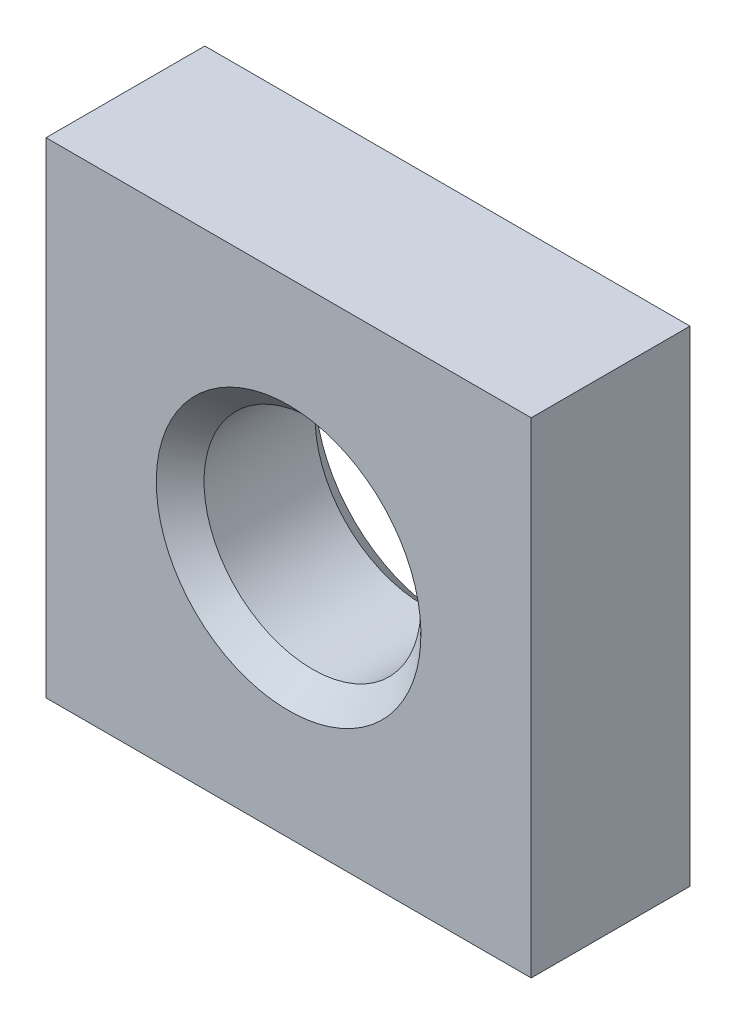
ISO-10303-21;
HEADER;
FILE_DESCRIPTION(('STEP AP214'),'2;1');
FILE_NAME('part.step','',(''),(''),'','','');
FILE_SCHEMA(('AUTOMOTIVE_DESIGN { 1 0 10303 214 1 1 1 1 }'));
ENDSEC;
DATA;
#1=APPLICATION_CONTEXT('core data for automotive mechanical design processes');
#2=APPLICATION_PROTOCOL_DEFINITION('international standard','automotive_design',2000,#1);
#3=PRODUCT_CONTEXT('',#1,'mechanical');
#4=PRODUCT('Part','Part','',(#3));
#5=PRODUCT_RELATED_PRODUCT_CATEGORY('part','',(#4));
#6=PRODUCT_DEFINITION_FORMATION('','',#4);
#7=PRODUCT_DEFINITION_CONTEXT('part definition',#1,'design');
#8=PRODUCT_DEFINITION('design','',#6,#7);
#9=PRODUCT_DEFINITION_SHAPE('','',#8);
#10=(LENGTH_UNIT() NAMED_UNIT(*) SI_UNIT(.MILLI.,.METRE.));
#11=(NAMED_UNIT(*) PLANE_ANGLE_UNIT() SI_UNIT($,.RADIAN.));
#12=(NAMED_UNIT(*) SI_UNIT($,.STERADIAN.) SOLID_ANGLE_UNIT());
#13=UNCERTAINTY_MEASURE_WITH_UNIT(LENGTH_MEASURE(1.E-05),#10,'distance_accuracy_value','');
#14=(GEOMETRIC_REPRESENTATION_CONTEXT(3) GLOBAL_UNCERTAINTY_ASSIGNED_CONTEXT((#13)) GLOBAL_UNIT_ASSIGNED_CONTEXT((#10,
#11,#12)) REPRESENTATION_CONTEXT('',''));
#15=CARTESIAN_POINT('',(0.,0.,0.));
#16=DIRECTION('',(0.,0.,1.));
#17=DIRECTION('',(1.,0.,0.));
#18=AXIS2_PLACEMENT_3D('',#15,#16,#17);
#19=CARTESIAN_POINT('',(0.,-2.75,0.9));
#20=DIRECTION('',(0.,-1.,0.));
#21=DIRECTION('',(1.,0.,0.));
#22=AXIS2_PLACEMENT_3D('',#19,#20,#21);
#23=PLANE('',#22);
#24=DIRECTION('',(-1.,0.,0.));
#25=VECTOR('',#24,1.);
#26=CARTESIAN_POINT('',(0.,-2.75,0.));
#27=LINE('',#26,#25);
#28=CARTESIAN_POINT('',(2.75,-2.75,0.));
#29=VERTEX_POINT('',#28);
#30=CARTESIAN_POINT('',(-2.75,-2.75,0.));
#31=VERTEX_POINT('',#30);
#32=EDGE_CURVE('E11',#29,#31,#27,.T.);
#33=ORIENTED_EDGE('',*,*,#32,.F.);
#34=DIRECTION('',(0.,0.,-1.));
#35=VECTOR('',#34,1.);
#36=CARTESIAN_POINT('',(2.75,-2.75,0.9));
#37=LINE('',#36,#35);
#38=CARTESIAN_POINT('',(2.75,-2.75,1.8));
#39=VERTEX_POINT('',#38);
#40=EDGE_CURVE('E61',#39,#29,#37,.T.);
#41=ORIENTED_EDGE('',*,*,#40,.F.);
#42=DIRECTION('',(1.,0.,0.));
#43=VECTOR('',#42,1.);
#44=CARTESIAN_POINT('',(0.,-2.75,1.8));
#45=LINE('',#44,#43);
#46=CARTESIAN_POINT('',(-2.75,-2.75,1.8));
#47=VERTEX_POINT('',#46);
#48=EDGE_CURVE('E102',#47,#39,#45,.T.);
#49=ORIENTED_EDGE('',*,*,#48,.F.);
#50=DIRECTION('',(0.,0.,1.));
#51=VECTOR('',#50,1.);
#52=CARTESIAN_POINT('',(-2.75,-2.75,0.9));
#53=LINE('',#52,#51);
#54=EDGE_CURVE('E24',#31,#47,#53,.T.);
#55=ORIENTED_EDGE('',*,*,#54,.F.);
#56=EDGE_LOOP('',(#33,#41,#49,#55));
#57=FACE_BOUND('',#56,.T.);
#58=ADVANCED_FACE('F16',(#57),#23,.T.);
#59=CARTESIAN_POINT('',(0.,2.75,0.));
#60=DIRECTION('',(0.,0.,-1.));
#61=DIRECTION('',(0.,1.,0.));
#62=AXIS2_PLACEMENT_3D('',#59,#60,#61);
#63=PLANE('',#62);
#64=CARTESIAN_POINT('',(0.,0.,0.));
#65=DIRECTION('',(0.,0.,-1.));
#66=DIRECTION('',(0.,1.,0.));
#67=AXIS2_PLACEMENT_3D('',#64,#65,#66);
#68=CIRCLE('',#67,1.5);
#69=CARTESIAN_POINT('',(0.,1.5,0.));
#70=VERTEX_POINT('',#69);
#71=EDGE_CURVE('E74',#70,#70,#68,.T.);
#72=ORIENTED_EDGE('',*,*,#71,.F.);
#73=EDGE_LOOP('',(#72));
#74=FACE_BOUND('',#73,.T.);
#75=DIRECTION('',(0.,-1.,0.));
#76=VECTOR('',#75,1.);
#77=CARTESIAN_POINT('',(2.75,2.75,0.));
#78=LINE('',#77,#76);
#79=CARTESIAN_POINT('',(2.75,2.75,0.));
#80=VERTEX_POINT('',#79);
#81=EDGE_CURVE('E54',#80,#29,#78,.T.);
#82=ORIENTED_EDGE('',*,*,#81,.T.);
#83=ORIENTED_EDGE('',*,*,#32,.T.);
#84=DIRECTION('',(0.,-1.,0.));
#85=VECTOR('',#84,1.);
#86=CARTESIAN_POINT('',(-2.75,2.75,0.));
#87=LINE('',#86,#85);
#88=CARTESIAN_POINT('',(-2.75,2.75,0.));
#89=VERTEX_POINT('',#88);
#90=EDGE_CURVE('E68',#89,#31,#87,.T.);
#91=ORIENTED_EDGE('',*,*,#90,.F.);
#92=DIRECTION('',(1.,0.,0.));
#93=VECTOR('',#92,1.);
#94=CARTESIAN_POINT('',(0.,2.75,0.));
#95=LINE('',#94,#93);
#96=EDGE_CURVE('E66',#89,#80,#95,.T.);
#97=ORIENTED_EDGE('',*,*,#96,.T.);
#98=EDGE_LOOP('',(#82,#83,#91,#97));
#99=FACE_BOUND('',#98,.T.);
#100=ADVANCED_FACE('F67',(#74,#99),#63,.T.);
#101=CARTESIAN_POINT('',(-2.75,2.75,0.9));
#102=DIRECTION('',(-1.,0.,0.));
#103=DIRECTION('',(0.,-1.,0.));
#104=AXIS2_PLACEMENT_3D('',#101,#102,#103);
#105=PLANE('',#104);
#106=ORIENTED_EDGE('',*,*,#90,.T.);
#107=ORIENTED_EDGE('',*,*,#54,.T.);
#108=DIRECTION('',(0.,-1.,0.));
#109=VECTOR('',#108,1.);
#110=CARTESIAN_POINT('',(-2.75,2.75,1.8));
#111=LINE('',#110,#109);
#112=CARTESIAN_POINT('',(-2.75,2.75,1.8));
#113=VERTEX_POINT('',#112);
#114=EDGE_CURVE('E94',#113,#47,#111,.T.);
#115=ORIENTED_EDGE('',*,*,#114,.F.);
#116=DIRECTION('',(0.,0.,-1.));
#117=VECTOR('',#116,1.);
#118=CARTESIAN_POINT('',(-2.75,2.75,0.9));
#119=LINE('',#118,#117);
#120=EDGE_CURVE('E73',#113,#89,#119,.T.);
#121=ORIENTED_EDGE('',*,*,#120,.T.);
#122=EDGE_LOOP('',(#106,#107,#115,#121));
#123=FACE_BOUND('',#122,.T.);
#124=ADVANCED_FACE('F114',(#123),#105,.T.);
#125=CARTESIAN_POINT('',(0.,2.75,1.8));
#126=DIRECTION('',(0.,0.,1.));
#127=DIRECTION('',(0.,-1.,0.));
#128=AXIS2_PLACEMENT_3D('',#125,#126,#127);
#129=PLANE('',#128);
#130=CARTESIAN_POINT('',(0.,0.,1.8));
#131=DIRECTION('',(0.,0.,-1.));
#132=DIRECTION('',(0.,1.,0.));
#133=AXIS2_PLACEMENT_3D('',#130,#131,#132);
#134=CIRCLE('',#133,1.5);
#135=CARTESIAN_POINT('',(0.,1.5,1.8));
#136=VERTEX_POINT('',#135);
#137=EDGE_CURVE('E149',#136,#136,#134,.T.);
#138=ORIENTED_EDGE('',*,*,#137,.T.);
#139=EDGE_LOOP('',(#138));
#140=FACE_BOUND('',#139,.T.);
#141=ORIENTED_EDGE('',*,*,#114,.T.);
#142=ORIENTED_EDGE('',*,*,#48,.T.);
#143=DIRECTION('',(0.,-1.,0.));
#144=VECTOR('',#143,1.);
#145=CARTESIAN_POINT('',(2.75,2.75,1.8));
#146=LINE('',#145,#144);
#147=CARTESIAN_POINT('',(2.75,2.75,1.8));
#148=VERTEX_POINT('',#147);
#149=EDGE_CURVE('E63',#148,#39,#146,.T.);
#150=ORIENTED_EDGE('',*,*,#149,.F.);
#151=DIRECTION('',(-1.,0.,0.));
#152=VECTOR('',#151,1.);
#153=CARTESIAN_POINT('',(0.,2.75,1.8));
#154=LINE('',#153,#152);
#155=EDGE_CURVE('E79',#148,#113,#154,.T.);
#156=ORIENTED_EDGE('',*,*,#155,.T.);
#157=EDGE_LOOP('',(#141,#142,#150,#156));
#158=FACE_BOUND('',#157,.T.);
#159=ADVANCED_FACE('F131',(#140,#158),#129,.T.);
#160=CARTESIAN_POINT('',(0.,2.75,0.9));
#161=DIRECTION('',(0.,1.,0.));
#162=DIRECTION('',(-1.,0.,0.));
#163=AXIS2_PLACEMENT_3D('',#160,#161,#162);
#164=PLANE('',#163);
#165=DIRECTION('',(0.,0.,1.));
#166=VECTOR('',#165,1.);
#167=CARTESIAN_POINT('',(2.75,2.75,0.9));
#168=LINE('',#167,#166);
#169=EDGE_CURVE('E59',#80,#148,#168,.T.);
#170=ORIENTED_EDGE('',*,*,#169,.F.);
#171=ORIENTED_EDGE('',*,*,#96,.F.);
#172=ORIENTED_EDGE('',*,*,#120,.F.);
#173=ORIENTED_EDGE('',*,*,#155,.F.);
#174=EDGE_LOOP('',(#170,#171,#172,#173));
#175=FACE_BOUND('',#174,.T.);
#176=ADVANCED_FACE('F77',(#175),#164,.T.);
#177=CARTESIAN_POINT('',(2.75,2.75,0.9));
#178=DIRECTION('',(1.,0.,0.));
#179=DIRECTION('',(0.,1.,0.));
#180=AXIS2_PLACEMENT_3D('',#177,#178,#179);
#181=PLANE('',#180);
#182=ORIENTED_EDGE('',*,*,#169,.T.);
#183=ORIENTED_EDGE('',*,*,#149,.T.);
#184=ORIENTED_EDGE('',*,*,#40,.T.);
#185=ORIENTED_EDGE('',*,*,#81,.F.);
#186=EDGE_LOOP('',(#182,#183,#184,#185));
#187=FACE_BOUND('',#186,.T.);
#188=ADVANCED_FACE('F56',(#187),#181,.T.);
#189=CARTESIAN_POINT('',(0.,0.,0.));
#190=DIRECTION('',(0.,0.,-1.));
#191=DIRECTION('',(0.,1.,0.));
#192=AXIS2_PLACEMENT_3D('',#189,#190,#191);
#193=CONICAL_SURFACE('',#192,1.5,0.785398163397448);
#194=CARTESIAN_POINT('',(0.,0.,0.270625));
#195=DIRECTION('',(0.,0.,-1.));
#196=DIRECTION('',(0.,1.,0.));
#197=AXIS2_PLACEMENT_3D('',#194,#195,#196);
#198=CIRCLE('',#197,1.229375);
#199=CARTESIAN_POINT('',(0.,1.229375,0.270625));
#200=VERTEX_POINT('',#199);
#201=EDGE_CURVE('E124',#200,#200,#198,.T.);
#202=ORIENTED_EDGE('',*,*,#201,.F.);
#203=EDGE_LOOP('',(#202));
#204=FACE_BOUND('',#203,.T.);
#205=ORIENTED_EDGE('',*,*,#71,.T.);
#206=EDGE_LOOP('',(#205));
#207=FACE_BOUND('',#206,.T.);
#208=ADVANCED_FACE('F172',(#204,#207),#193,.F.);
#209=CARTESIAN_POINT('',(0.,0.,0.));
#210=DIRECTION('',(0.,0.,-1.));
#211=DIRECTION('',(0.,1.,0.));
#212=AXIS2_PLACEMENT_3D('',#209,#210,#211);
#213=CYLINDRICAL_SURFACE('',#212,1.229375);
#214=CARTESIAN_POINT('',(0.,0.,1.529375));
#215=DIRECTION('',(0.,0.,-1.));
#216=DIRECTION('',(0.,1.,0.));
#217=AXIS2_PLACEMENT_3D('',#214,#215,#216);
#218=CIRCLE('',#217,1.229375);
#219=CARTESIAN_POINT('',(0.,1.229375,1.529375));
#220=VERTEX_POINT('',#219);
#221=EDGE_CURVE('E152',#220,#220,#218,.T.);
#222=ORIENTED_EDGE('',*,*,#221,.F.);
#223=EDGE_LOOP('',(#222));
#224=FACE_BOUND('',#223,.T.);
#225=ORIENTED_EDGE('',*,*,#201,.T.);
#226=EDGE_LOOP('',(#225));
#227=FACE_BOUND('',#226,.T.);
#228=ADVANCED_FACE('F182',(#224,#227),#213,.F.);
#229=CARTESIAN_POINT('',(0.,0.,1.529375));
#230=DIRECTION('',(0.,0.,1.));
#231=DIRECTION('',(0.,-1.,0.));
#232=AXIS2_PLACEMENT_3D('',#229,#230,#231);
#233=CONICAL_SURFACE('',#232,1.229375,0.785398163397448);
#234=ORIENTED_EDGE('',*,*,#137,.F.);
#235=EDGE_LOOP('',(#234));
#236=FACE_BOUND('',#235,.T.);
#237=ORIENTED_EDGE('',*,*,#221,.T.);
#238=EDGE_LOOP('',(#237));
#239=FACE_BOUND('',#238,.T.);
#240=ADVANCED_FACE('F194',(#236,#239),#233,.F.);
#241=CLOSED_SHELL('',(#58,#100,#124,#159,#176,#188,#208,#228,#240));
#242=MANIFOLD_SOLID_BREP('B1',#241);
#243=ADVANCED_BREP_SHAPE_REPRESENTATION('',(#18,#242),#14);
#244=SHAPE_DEFINITION_REPRESENTATION(#9,#243);
ENDSEC;
END-ISO-10303-21;
